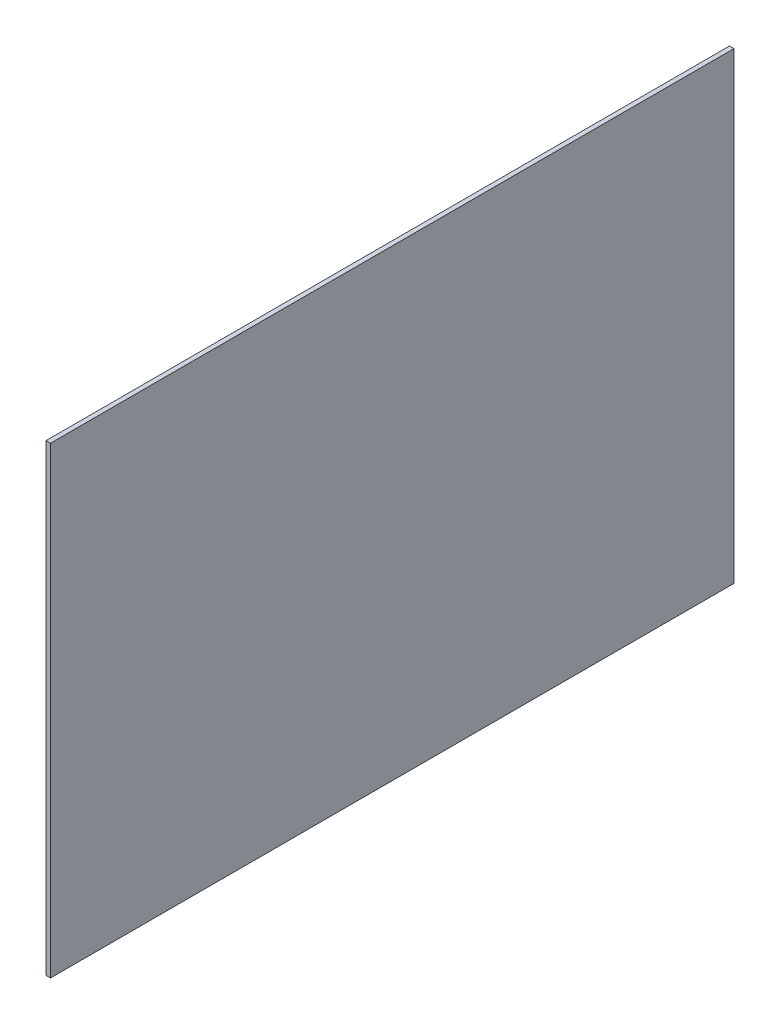
ISO-10303-21;
HEADER;
FILE_DESCRIPTION(('STEP AP214'),'2;1');
FILE_NAME('part.step','',(''),(''),'','','');
FILE_SCHEMA(('AUTOMOTIVE_DESIGN { 1 0 10303 214 1 1 1 1 }'));
ENDSEC;
DATA;
#1=APPLICATION_CONTEXT('core data for automotive mechanical design processes');
#2=APPLICATION_PROTOCOL_DEFINITION('international standard','automotive_design',2000,#1);
#3=PRODUCT_CONTEXT('',#1,'mechanical');
#4=PRODUCT('Part','Part','',(#3));
#5=PRODUCT_RELATED_PRODUCT_CATEGORY('part','',(#4));
#6=PRODUCT_DEFINITION_FORMATION('','',#4);
#7=PRODUCT_DEFINITION_CONTEXT('part definition',#1,'design');
#8=PRODUCT_DEFINITION('design','',#6,#7);
#9=PRODUCT_DEFINITION_SHAPE('','',#8);
#10=(LENGTH_UNIT() NAMED_UNIT(*) SI_UNIT(.MILLI.,.METRE.));
#11=(NAMED_UNIT(*) PLANE_ANGLE_UNIT() SI_UNIT($,.RADIAN.));
#12=(NAMED_UNIT(*) SI_UNIT($,.STERADIAN.) SOLID_ANGLE_UNIT());
#13=UNCERTAINTY_MEASURE_WITH_UNIT(LENGTH_MEASURE(1.E-05),#10,'distance_accuracy_value','');
#14=(GEOMETRIC_REPRESENTATION_CONTEXT(3) GLOBAL_UNCERTAINTY_ASSIGNED_CONTEXT((#13)) GLOBAL_UNIT_ASSIGNED_CONTEXT((#10,
#11,#12)) REPRESENTATION_CONTEXT('',''));
#15=CARTESIAN_POINT('',(0.,0.,0.));
#16=DIRECTION('',(0.,0.,1.));
#17=DIRECTION('',(1.,0.,0.));
#18=AXIS2_PLACEMENT_3D('',#15,#16,#17);
#19=CARTESIAN_POINT('',(3.,154.9,-228.6));
#20=DIRECTION('',(0.,0.,1.));
#21=DIRECTION('',(0.,-1.,0.));
#22=AXIS2_PLACEMENT_3D('',#19,#20,#21);
#23=PLANE('',#22);
#24=DIRECTION('',(0.,1.,0.));
#25=VECTOR('',#24,1.);
#26=CARTESIAN_POINT('',(0.,154.9,-228.6));
#27=LINE('',#26,#25);
#28=CARTESIAN_POINT('',(0.,-154.9,-228.6));
#29=VERTEX_POINT('',#28);
#30=CARTESIAN_POINT('',(0.,154.9,-228.6));
#31=VERTEX_POINT('',#30);
#32=EDGE_CURVE('E95',#29,#31,#27,.T.);
#33=ORIENTED_EDGE('',*,*,#32,.T.);
#34=DIRECTION('',(-1.,0.,0.));
#35=VECTOR('',#34,1.);
#36=CARTESIAN_POINT('',(3.,154.9,-228.6));
#37=LINE('',#36,#35);
#38=CARTESIAN_POINT('',(3.,154.9,-228.6));
#39=VERTEX_POINT('',#38);
#40=EDGE_CURVE('E11',#39,#31,#37,.T.);
#41=ORIENTED_EDGE('',*,*,#40,.F.);
#42=DIRECTION('',(0.,1.,0.));
#43=VECTOR('',#42,1.);
#44=CARTESIAN_POINT('',(3.,154.9,-228.6));
#45=LINE('',#44,#43);
#46=CARTESIAN_POINT('',(3.,-154.9,-228.6));
#47=VERTEX_POINT('',#46);
#48=EDGE_CURVE('E83',#47,#39,#45,.T.);
#49=ORIENTED_EDGE('',*,*,#48,.F.);
#50=DIRECTION('',(-1.,0.,0.));
#51=VECTOR('',#50,1.);
#52=CARTESIAN_POINT('',(3.,-154.9,-228.6));
#53=LINE('',#52,#51);
#54=EDGE_CURVE('E91',#47,#29,#53,.T.);
#55=ORIENTED_EDGE('',*,*,#54,.T.);
#56=EDGE_LOOP('',(#33,#41,#49,#55));
#57=FACE_BOUND('',#56,.T.);
#58=ADVANCED_FACE('F32',(#57),#23,.F.);
#59=CARTESIAN_POINT('',(3.,154.9,228.6));
#60=DIRECTION('',(0.,-1.,0.));
#61=DIRECTION('',(0.,0.,-1.));
#62=AXIS2_PLACEMENT_3D('',#59,#60,#61);
#63=PLANE('',#62);
#64=DIRECTION('',(0.,0.,1.));
#65=VECTOR('',#64,1.);
#66=CARTESIAN_POINT('',(0.,154.9,228.6));
#67=LINE('',#66,#65);
#68=CARTESIAN_POINT('',(0.,154.9,228.6));
#69=VERTEX_POINT('',#68);
#70=EDGE_CURVE('E87',#31,#69,#67,.T.);
#71=ORIENTED_EDGE('',*,*,#70,.T.);
#72=DIRECTION('',(-1.,0.,0.));
#73=VECTOR('',#72,1.);
#74=CARTESIAN_POINT('',(3.,154.9,228.6));
#75=LINE('',#74,#73);
#76=CARTESIAN_POINT('',(3.,154.9,228.6));
#77=VERTEX_POINT('',#76);
#78=EDGE_CURVE('E40',#77,#69,#75,.T.);
#79=ORIENTED_EDGE('',*,*,#78,.F.);
#80=DIRECTION('',(0.,0.,1.));
#81=VECTOR('',#80,1.);
#82=CARTESIAN_POINT('',(3.,154.9,228.6));
#83=LINE('',#82,#81);
#84=EDGE_CURVE('E78',#39,#77,#83,.T.);
#85=ORIENTED_EDGE('',*,*,#84,.F.);
#86=ORIENTED_EDGE('',*,*,#40,.T.);
#87=EDGE_LOOP('',(#71,#79,#85,#86));
#88=FACE_BOUND('',#87,.T.);
#89=ADVANCED_FACE('F86',(#88),#63,.F.);
#90=CARTESIAN_POINT('',(3.,154.9,228.6));
#91=DIRECTION('',(0.,0.,-1.));
#92=DIRECTION('',(0.,1.,0.));
#93=AXIS2_PLACEMENT_3D('',#90,#91,#92);
#94=PLANE('',#93);
#95=DIRECTION('',(0.,-1.,0.));
#96=VECTOR('',#95,1.);
#97=CARTESIAN_POINT('',(0.,154.9,228.6));
#98=LINE('',#97,#96);
#99=CARTESIAN_POINT('',(0.,-154.9,228.6));
#100=VERTEX_POINT('',#99);
#101=EDGE_CURVE('E65',#69,#100,#98,.T.);
#102=ORIENTED_EDGE('',*,*,#101,.T.);
#103=DIRECTION('',(-1.,0.,0.));
#104=VECTOR('',#103,1.);
#105=CARTESIAN_POINT('',(3.,-154.9,228.6));
#106=LINE('',#105,#104);
#107=CARTESIAN_POINT('',(3.,-154.9,228.6));
#108=VERTEX_POINT('',#107);
#109=EDGE_CURVE('E88',#108,#100,#106,.T.);
#110=ORIENTED_EDGE('',*,*,#109,.F.);
#111=DIRECTION('',(0.,-1.,0.));
#112=VECTOR('',#111,1.);
#113=CARTESIAN_POINT('',(3.,154.9,228.6));
#114=LINE('',#113,#112);
#115=EDGE_CURVE('E81',#77,#108,#114,.T.);
#116=ORIENTED_EDGE('',*,*,#115,.F.);
#117=ORIENTED_EDGE('',*,*,#78,.T.);
#118=EDGE_LOOP('',(#102,#110,#116,#117));
#119=FACE_BOUND('',#118,.T.);
#120=ADVANCED_FACE('F89',(#119),#94,.F.);
#121=CARTESIAN_POINT('',(3.,-154.9,228.6));
#122=DIRECTION('',(0.,1.,0.));
#123=DIRECTION('',(0.,0.,1.));
#124=AXIS2_PLACEMENT_3D('',#121,#122,#123);
#125=PLANE('',#124);
#126=DIRECTION('',(0.,0.,-1.));
#127=VECTOR('',#126,1.);
#128=CARTESIAN_POINT('',(0.,-154.9,228.6));
#129=LINE('',#128,#127);
#130=EDGE_CURVE('E71',#100,#29,#129,.T.);
#131=ORIENTED_EDGE('',*,*,#130,.T.);
#132=ORIENTED_EDGE('',*,*,#54,.F.);
#133=DIRECTION('',(0.,0.,-1.));
#134=VECTOR('',#133,1.);
#135=CARTESIAN_POINT('',(3.,-154.9,228.6));
#136=LINE('',#135,#134);
#137=EDGE_CURVE('E48',#108,#47,#136,.T.);
#138=ORIENTED_EDGE('',*,*,#137,.F.);
#139=ORIENTED_EDGE('',*,*,#109,.T.);
#140=EDGE_LOOP('',(#131,#132,#138,#139));
#141=FACE_BOUND('',#140,.T.);
#142=ADVANCED_FACE('F102',(#141),#125,.F.);
#143=CARTESIAN_POINT('',(3.,0.,0.));
#144=DIRECTION('',(1.,0.,0.));
#145=DIRECTION('',(0.,0.,-1.));
#146=AXIS2_PLACEMENT_3D('',#143,#144,#145);
#147=PLANE('',#146);
#148=ORIENTED_EDGE('',*,*,#48,.T.);
#149=ORIENTED_EDGE('',*,*,#84,.T.);
#150=ORIENTED_EDGE('',*,*,#115,.T.);
#151=ORIENTED_EDGE('',*,*,#137,.T.);
#152=EDGE_LOOP('',(#148,#149,#150,#151));
#153=FACE_BOUND('',#152,.T.);
#154=ADVANCED_FACE('F79',(#153),#147,.T.);
#155=CARTESIAN_POINT('',(0.,0.,0.));
#156=DIRECTION('',(1.,0.,0.));
#157=DIRECTION('',(0.,0.,-1.));
#158=AXIS2_PLACEMENT_3D('',#155,#156,#157);
#159=PLANE('',#158);
#160=ORIENTED_EDGE('',*,*,#32,.F.);
#161=ORIENTED_EDGE('',*,*,#130,.F.);
#162=ORIENTED_EDGE('',*,*,#101,.F.);
#163=ORIENTED_EDGE('',*,*,#70,.F.);
#164=EDGE_LOOP('',(#160,#161,#162,#163));
#165=FACE_BOUND('',#164,.T.);
#166=ADVANCED_FACE('F105',(#165),#159,.F.);
#167=CLOSED_SHELL('',(#58,#89,#120,#142,#154,#166));
#168=MANIFOLD_SOLID_BREP('B2',#167);
#169=ADVANCED_BREP_SHAPE_REPRESENTATION('',(#18,#168),#14);
#170=SHAPE_DEFINITION_REPRESENTATION(#9,#169);
ENDSEC;
END-ISO-10303-21;
